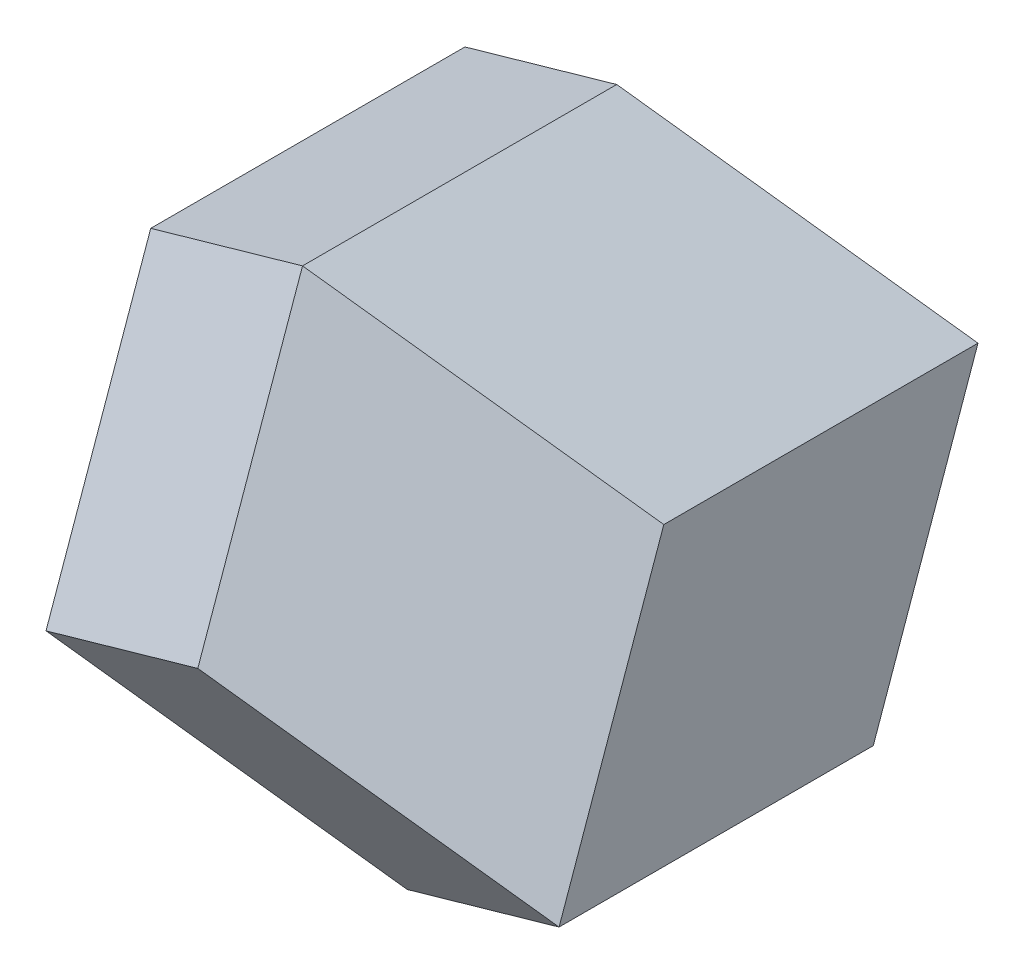
ISO-10303-21;
HEADER;
FILE_DESCRIPTION(('STEP AP214'),'2;1');
FILE_NAME('part.step','',(''),(''),'','','');
FILE_SCHEMA(('AUTOMOTIVE_DESIGN { 1 0 10303 214 1 1 1 1 }'));
ENDSEC;
DATA;
#1=APPLICATION_CONTEXT('core data for automotive mechanical design processes');
#2=APPLICATION_PROTOCOL_DEFINITION('international standard','automotive_design',2000,#1);
#3=PRODUCT_CONTEXT('',#1,'mechanical');
#4=PRODUCT('Part','Part','',(#3));
#5=PRODUCT_RELATED_PRODUCT_CATEGORY('part','',(#4));
#6=PRODUCT_DEFINITION_FORMATION('','',#4);
#7=PRODUCT_DEFINITION_CONTEXT('part definition',#1,'design');
#8=PRODUCT_DEFINITION('design','',#6,#7);
#9=PRODUCT_DEFINITION_SHAPE('','',#8);
#10=(LENGTH_UNIT() NAMED_UNIT(*) SI_UNIT(.MILLI.,.METRE.));
#11=(NAMED_UNIT(*) PLANE_ANGLE_UNIT() SI_UNIT($,.RADIAN.));
#12=(NAMED_UNIT(*) SI_UNIT($,.STERADIAN.) SOLID_ANGLE_UNIT());
#13=UNCERTAINTY_MEASURE_WITH_UNIT(LENGTH_MEASURE(1.E-05),#10,'distance_accuracy_value','');
#14=(GEOMETRIC_REPRESENTATION_CONTEXT(3) GLOBAL_UNCERTAINTY_ASSIGNED_CONTEXT((#13)) GLOBAL_UNIT_ASSIGNED_CONTEXT((#10,
#11,#12)) REPRESENTATION_CONTEXT('',''));
#15=CARTESIAN_POINT('',(0.,0.,0.));
#16=DIRECTION('',(0.,0.,1.));
#17=DIRECTION('',(1.,0.,0.));
#18=AXIS2_PLACEMENT_3D('',#15,#16,#17);
#19=CARTESIAN_POINT('',(-0.816496580928,-0.471404640838,-0.333333418219));
#20=DIRECTION('',(-0.50000000000022,-0.288674987568127,-0.81649663290936));
#21=DIRECTION('',(-0.852802880229533,0.,0.522232943687215));
#22=AXIS2_PLACEMENT_3D('',#19,#20,#21);
#23=PLANE('',#22);
#24=DIRECTION('',(-0.816496580927737,0.471404460767848,0.333333418218893));
#25=VECTOR('',#24,1.);
#26=CARTESIAN_POINT('',(0.,0.,-1.));
#27=LINE('',#26,#25);
#28=CARTESIAN_POINT('',(0.,0.,-1.));
#29=VERTEX_POINT('',#28);
#30=CARTESIAN_POINT('',(-0.816496580928,0.471404460768,-0.666666581781));
#31=VERTEX_POINT('',#30);
#32=EDGE_CURVE('E161',#29,#31,#27,.T.);
#33=ORIENTED_EDGE('',*,*,#32,.F.);
#34=DIRECTION('',(0.,-0.942809101605246,0.333333163562087));
#35=VECTOR('',#34,1.);
#36=CARTESIAN_POINT('',(0.,0.,-1.));
#37=LINE('',#36,#35);
#38=CARTESIAN_POINT('',(0.,-0.942809101605,-0.666666836438));
#39=VERTEX_POINT('',#38);
#40=EDGE_CURVE('E9',#29,#39,#37,.T.);
#41=ORIENTED_EDGE('',*,*,#40,.T.);
#42=DIRECTION('',(0.816496580927737,-0.471404460767848,-0.333333418218893));
#43=VECTOR('',#42,1.);
#44=CARTESIAN_POINT('',(-0.816496580928,-0.471404640838,-0.333333418219));
#45=LINE('',#44,#43);
#46=CARTESIAN_POINT('',(-0.816496580928,-0.471404640838,-0.333333418219));
#47=VERTEX_POINT('',#46);
#48=EDGE_CURVE('E25',#47,#39,#45,.T.);
#49=ORIENTED_EDGE('',*,*,#48,.F.);
#50=DIRECTION('',(0.,0.942809101605246,-0.333333163562087));
#51=VECTOR('',#50,1.);
#52=CARTESIAN_POINT('',(-0.816496580928,-0.471404640838,-0.333333418219));
#53=LINE('',#52,#51);
#54=EDGE_CURVE('E174',#47,#31,#53,.T.);
#55=ORIENTED_EDGE('',*,*,#54,.T.);
#56=EDGE_LOOP('',(#33,#41,#49,#55));
#57=FACE_BOUND('',#56,.T.);
#58=ADVANCED_FACE('F14',(#57),#23,.T.);
#59=CARTESIAN_POINT('',(0.,0.,-1.));
#60=DIRECTION('',(0.50000000000022,-0.288674987568127,-0.81649663290936));
#61=DIRECTION('',(0.,-0.942809101605422,0.333333163561589));
#62=AXIS2_PLACEMENT_3D('',#59,#60,#61);
#63=PLANE('',#62);
#64=DIRECTION('',(0.,0.942809101605246,-0.333333163562087));
#65=VECTOR('',#64,1.);
#66=CARTESIAN_POINT('',(0.816496580928,-0.471404640838,-0.333333418219));
#67=LINE('',#66,#65);
#68=CARTESIAN_POINT('',(0.816496580928,-0.471404640838,-0.333333418219));
#69=VERTEX_POINT('',#68);
#70=CARTESIAN_POINT('',(0.816496580928,0.471404460768,-0.666666581781));
#71=VERTEX_POINT('',#70);
#72=EDGE_CURVE('E150',#69,#71,#67,.T.);
#73=ORIENTED_EDGE('',*,*,#72,.F.);
#74=DIRECTION('',(-0.816496580927737,-0.471404460767848,-0.333333418218893));
#75=VECTOR('',#74,1.);
#76=CARTESIAN_POINT('',(0.816496580928,-0.471404640838,-0.333333418219));
#77=LINE('',#76,#75);
#78=EDGE_CURVE('E88',#69,#39,#77,.T.);
#79=ORIENTED_EDGE('',*,*,#78,.T.);
#80=ORIENTED_EDGE('',*,*,#40,.F.);
#81=DIRECTION('',(0.816496580927737,0.471404460767848,0.333333418218893));
#82=VECTOR('',#81,1.);
#83=CARTESIAN_POINT('',(0.,0.,-1.));
#84=LINE('',#83,#82);
#85=EDGE_CURVE('E164',#29,#71,#84,.T.);
#86=ORIENTED_EDGE('',*,*,#85,.T.);
#87=EDGE_LOOP('',(#73,#79,#80,#86));
#88=FACE_BOUND('',#87,.T.);
#89=ADVANCED_FACE('F206',(#88),#63,.T.);
#90=CARTESIAN_POINT('',(0.,-0.942809281675,0.333333163562));
#91=DIRECTION('',(-0.500000000000184,-0.866025403784318,-1.55945109048358E-07));
#92=DIRECTION('',(-0.866025403784329,0.50000000000019,0.));
#93=AXIS2_PLACEMENT_3D('',#90,#91,#92);
#94=PLANE('',#93);
#95=DIRECTION('',(0.,-1.80069901267697E-07,0.999999999999984));
#96=VECTOR('',#95,1.);
#97=CARTESIAN_POINT('',(-0.816496580928,-0.471404640838,-0.333333418219));
#98=LINE('',#97,#96);
#99=CARTESIAN_POINT('',(-0.816496580928,-0.471404820908,0.666666581781));
#100=VERTEX_POINT('',#99);
#101=EDGE_CURVE('E139',#47,#100,#98,.T.);
#102=ORIENTED_EDGE('',*,*,#101,.F.);
#103=ORIENTED_EDGE('',*,*,#48,.T.);
#104=DIRECTION('',(0.,1.80069900934697E-07,-0.999999999999984));
#105=VECTOR('',#104,1.);
#106=CARTESIAN_POINT('',(0.,-0.942809281675,0.333333163562));
#107=LINE('',#106,#105);
#108=CARTESIAN_POINT('',(0.,-0.942809281675,0.333333163562));
#109=VERTEX_POINT('',#108);
#110=EDGE_CURVE('E79',#109,#39,#107,.T.);
#111=ORIENTED_EDGE('',*,*,#110,.F.);
#112=DIRECTION('',(-0.816496580927737,0.471404460767848,0.333333418218893));
#113=VECTOR('',#112,1.);
#114=CARTESIAN_POINT('',(0.,-0.942809281675,0.333333163562));
#115=LINE('',#114,#113);
#116=EDGE_CURVE('E84',#109,#100,#115,.T.);
#117=ORIENTED_EDGE('',*,*,#116,.T.);
#118=EDGE_LOOP('',(#102,#103,#111,#117));
#119=FACE_BOUND('',#118,.T.);
#120=ADVANCED_FACE('F82',(#119),#94,.T.);
#121=CARTESIAN_POINT('',(0.,0.942808921535,-0.333333163562));
#122=DIRECTION('',(0.,0.57735041621617,-0.81649647696424));
#123=DIRECTION('',(-1.,0.,0.));
#124=AXIS2_PLACEMENT_3D('',#121,#122,#123);
#125=PLANE('',#124);
#126=DIRECTION('',(-0.816496580927737,-0.471404460767848,-0.333333418218893));
#127=VECTOR('',#126,1.);
#128=CARTESIAN_POINT('',(0.,0.942808921535,-0.333333163562));
#129=LINE('',#128,#127);
#130=CARTESIAN_POINT('',(0.,0.942808921535,-0.333333163562));
#131=VERTEX_POINT('',#130);
#132=EDGE_CURVE('E147',#131,#31,#129,.T.);
#133=ORIENTED_EDGE('',*,*,#132,.F.);
#134=DIRECTION('',(0.816496580927737,-0.471404460767848,-0.333333418218893));
#135=VECTOR('',#134,1.);
#136=CARTESIAN_POINT('',(0.,0.942808921535,-0.333333163562));
#137=LINE('',#136,#135);
#138=EDGE_CURVE('E140',#131,#71,#137,.T.);
#139=ORIENTED_EDGE('',*,*,#138,.T.);
#140=ORIENTED_EDGE('',*,*,#85,.F.);
#141=ORIENTED_EDGE('',*,*,#32,.T.);
#142=EDGE_LOOP('',(#133,#139,#140,#141));
#143=FACE_BOUND('',#142,.T.);
#144=ADVANCED_FACE('F196',(#143),#125,.T.);
#145=CARTESIAN_POINT('',(-0.816496580928,0.471404280698,0.333333418219));
#146=DIRECTION('',(0.500000000000184,-0.866025403784319,-1.55945108715257E-07));
#147=DIRECTION('',(0.,1.8006990099114E-07,-0.999999999999984));
#148=AXIS2_PLACEMENT_3D('',#145,#146,#147);
#149=PLANE('',#148);
#150=DIRECTION('',(0.,1.80069901128997E-07,-0.999999999999984));
#151=VECTOR('',#150,1.);
#152=CARTESIAN_POINT('',(-0.816496580928,0.471404280698,0.333333418219));
#153=LINE('',#152,#151);
#154=CARTESIAN_POINT('',(-0.816496580928,0.471404280698,0.333333418219));
#155=VERTEX_POINT('',#154);
#156=EDGE_CURVE('E143',#155,#31,#153,.T.);
#157=ORIENTED_EDGE('',*,*,#156,.F.);
#158=DIRECTION('',(0.816496580927737,0.471404460767848,0.333333418218893));
#159=VECTOR('',#158,1.);
#160=CARTESIAN_POINT('',(-0.816496580928,0.471404280698,0.333333418219));
#161=LINE('',#160,#159);
#162=CARTESIAN_POINT('',(0.,0.942808741466,0.666666836438));
#163=VERTEX_POINT('',#162);
#164=EDGE_CURVE('E114',#155,#163,#161,.T.);
#165=ORIENTED_EDGE('',*,*,#164,.T.);
#166=DIRECTION('',(0.,-1.80069900934697E-07,0.999999999999984));
#167=VECTOR('',#166,1.);
#168=CARTESIAN_POINT('',(0.,0.942808921535,-0.333333163562));
#169=LINE('',#168,#167);
#170=EDGE_CURVE('E89',#131,#163,#169,.T.);
#171=ORIENTED_EDGE('',*,*,#170,.F.);
#172=ORIENTED_EDGE('',*,*,#132,.T.);
#173=EDGE_LOOP('',(#157,#165,#171,#172));
#174=FACE_BOUND('',#173,.T.);
#175=ADVANCED_FACE('F192',(#174),#149,.F.);
#176=CARTESIAN_POINT('',(-0.816496580928,0.471404280698,0.333333418219));
#177=DIRECTION('',(1.,0.,0.));
#178=DIRECTION('',(0.,0.,1.));
#179=AXIS2_PLACEMENT_3D('',#176,#177,#178);
#180=PLANE('',#179);
#181=ORIENTED_EDGE('',*,*,#54,.F.);
#182=ORIENTED_EDGE('',*,*,#101,.T.);
#183=DIRECTION('',(0.,-0.942809101605246,0.333333163562087));
#184=VECTOR('',#183,1.);
#185=CARTESIAN_POINT('',(-0.816496580928,0.471404280698,0.333333418219));
#186=LINE('',#185,#184);
#187=EDGE_CURVE('E117',#155,#100,#186,.T.);
#188=ORIENTED_EDGE('',*,*,#187,.F.);
#189=ORIENTED_EDGE('',*,*,#156,.T.);
#190=EDGE_LOOP('',(#181,#182,#188,#189));
#191=FACE_BOUND('',#190,.T.);
#192=ADVANCED_FACE('F183',(#191),#180,.F.);
#193=CARTESIAN_POINT('',(0.816496580928,-0.471404640838,-0.333333418219));
#194=DIRECTION('',(0.500000000000184,-0.866025403784319,-1.55945108715257E-07));
#195=DIRECTION('',(0.,1.8006990099114E-07,-0.999999999999984));
#196=AXIS2_PLACEMENT_3D('',#193,#194,#195);
#197=PLANE('',#196);
#198=DIRECTION('',(0.816496580927737,0.471404460767848,0.333333418218893));
#199=VECTOR('',#198,1.);
#200=CARTESIAN_POINT('',(0.,-0.942809281675,0.333333163562));
#201=LINE('',#200,#199);
#202=CARTESIAN_POINT('',(0.816496580928,-0.471404820908,0.666666581781));
#203=VERTEX_POINT('',#202);
#204=EDGE_CURVE('E93',#109,#203,#201,.T.);
#205=ORIENTED_EDGE('',*,*,#204,.F.);
#206=ORIENTED_EDGE('',*,*,#110,.T.);
#207=ORIENTED_EDGE('',*,*,#78,.F.);
#208=DIRECTION('',(0.,-1.80069901128997E-07,0.999999999999984));
#209=VECTOR('',#208,1.);
#210=CARTESIAN_POINT('',(0.816496580928,-0.471404640838,-0.333333418219));
#211=LINE('',#210,#209);
#212=EDGE_CURVE('E96',#69,#203,#211,.T.);
#213=ORIENTED_EDGE('',*,*,#212,.T.);
#214=EDGE_LOOP('',(#205,#206,#207,#213));
#215=FACE_BOUND('',#214,.T.);
#216=ADVANCED_FACE('F94',(#215),#197,.T.);
#217=CARTESIAN_POINT('',(0.,0.942808921535,-0.333333163562));
#218=DIRECTION('',(-0.500000000000184,-0.866025403784318,-1.55945109048358E-07));
#219=DIRECTION('',(-0.866025403784329,0.50000000000019,0.));
#220=AXIS2_PLACEMENT_3D('',#217,#218,#219);
#221=PLANE('',#220);
#222=ORIENTED_EDGE('',*,*,#138,.F.);
#223=ORIENTED_EDGE('',*,*,#170,.T.);
#224=DIRECTION('',(-0.816496580927737,0.471404460767848,0.333333418218893));
#225=VECTOR('',#224,1.);
#226=CARTESIAN_POINT('',(0.816496580928,0.471404280698,0.333333418219));
#227=LINE('',#226,#225);
#228=CARTESIAN_POINT('',(0.816496580928,0.471404280698,0.333333418219));
#229=VERTEX_POINT('',#228);
#230=EDGE_CURVE('E122',#229,#163,#227,.T.);
#231=ORIENTED_EDGE('',*,*,#230,.F.);
#232=DIRECTION('',(0.,1.80069901267697E-07,-0.999999999999984));
#233=VECTOR('',#232,1.);
#234=CARTESIAN_POINT('',(0.816496580928,0.471404280698,0.333333418219));
#235=LINE('',#234,#233);
#236=EDGE_CURVE('E118',#229,#71,#235,.T.);
#237=ORIENTED_EDGE('',*,*,#236,.T.);
#238=EDGE_LOOP('',(#222,#223,#231,#237));
#239=FACE_BOUND('',#238,.T.);
#240=ADVANCED_FACE('F216',(#239),#221,.F.);
#241=CARTESIAN_POINT('',(0.,-3.601398021469E-07,1.));
#242=DIRECTION('',(0.50000000000022,-0.288674987568127,-0.81649663290936));
#243=DIRECTION('',(0.,-0.942809101605422,0.333333163561589));
#244=AXIS2_PLACEMENT_3D('',#241,#242,#243);
#245=PLANE('',#244);
#246=DIRECTION('',(-0.816496580927737,-0.471404460767848,-0.333333418218893));
#247=VECTOR('',#246,1.);
#248=CARTESIAN_POINT('',(0.,-3.601398021469E-07,1.));
#249=LINE('',#248,#247);
#250=CARTESIAN_POINT('',(0.,-3.601398021759E-07,1.));
#251=VERTEX_POINT('',#250);
#252=EDGE_CURVE('E103',#251,#100,#249,.T.);
#253=ORIENTED_EDGE('',*,*,#252,.F.);
#254=DIRECTION('',(0.,0.942809101605246,-0.333333163562087));
#255=VECTOR('',#254,1.);
#256=CARTESIAN_POINT('',(0.,-3.601398022024E-07,1.));
#257=LINE('',#256,#255);
#258=EDGE_CURVE('E18',#251,#163,#257,.T.);
#259=ORIENTED_EDGE('',*,*,#258,.T.);
#260=ORIENTED_EDGE('',*,*,#164,.F.);
#261=ORIENTED_EDGE('',*,*,#187,.T.);
#262=EDGE_LOOP('',(#253,#259,#260,#261));
#263=FACE_BOUND('',#262,.T.);
#264=ADVANCED_FACE('F186',(#263),#245,.F.);
#265=CARTESIAN_POINT('',(0.816496580928,0.471404280698,0.333333418219));
#266=DIRECTION('',(-1.,0.,0.));
#267=DIRECTION('',(0.,0.,1.));
#268=AXIS2_PLACEMENT_3D('',#265,#266,#267);
#269=PLANE('',#268);
#270=ORIENTED_EDGE('',*,*,#212,.F.);
#271=ORIENTED_EDGE('',*,*,#72,.T.);
#272=ORIENTED_EDGE('',*,*,#236,.F.);
#273=DIRECTION('',(0.,-0.942809101605246,0.333333163562087));
#274=VECTOR('',#273,1.);
#275=CARTESIAN_POINT('',(0.816496580928,0.471404280698,0.333333418219));
#276=LINE('',#275,#274);
#277=EDGE_CURVE('E119',#229,#203,#276,.T.);
#278=ORIENTED_EDGE('',*,*,#277,.T.);
#279=EDGE_LOOP('',(#270,#271,#272,#278));
#280=FACE_BOUND('',#279,.T.);
#281=ADVANCED_FACE('F207',(#280),#269,.F.);
#282=CARTESIAN_POINT('',(0.,-3.601398022579E-07,1.));
#283=DIRECTION('',(0.,-0.57735041621617,0.81649647696424));
#284=DIRECTION('',(-1.,0.,0.));
#285=AXIS2_PLACEMENT_3D('',#282,#283,#284);
#286=PLANE('',#285);
#287=DIRECTION('',(0.816496580927737,-0.471404460767848,-0.333333418218893));
#288=VECTOR('',#287,1.);
#289=CARTESIAN_POINT('',(0.,-3.601398022579E-07,1.));
#290=LINE('',#289,#288);
#291=EDGE_CURVE('E109',#251,#203,#290,.T.);
#292=ORIENTED_EDGE('',*,*,#291,.F.);
#293=ORIENTED_EDGE('',*,*,#252,.T.);
#294=ORIENTED_EDGE('',*,*,#116,.F.);
#295=ORIENTED_EDGE('',*,*,#204,.T.);
#296=EDGE_LOOP('',(#292,#293,#294,#295));
#297=FACE_BOUND('',#296,.T.);
#298=ADVANCED_FACE('F102',(#297),#286,.T.);
#299=CARTESIAN_POINT('',(0.816496580928,0.471404280698,0.333333418219));
#300=DIRECTION('',(-0.50000000000022,-0.288674987568127,-0.81649663290936));
#301=DIRECTION('',(-0.852802880229533,0.,0.522232943687215));
#302=AXIS2_PLACEMENT_3D('',#299,#300,#301);
#303=PLANE('',#302);
#304=ORIENTED_EDGE('',*,*,#277,.F.);
#305=ORIENTED_EDGE('',*,*,#230,.T.);
#306=ORIENTED_EDGE('',*,*,#258,.F.);
#307=ORIENTED_EDGE('',*,*,#291,.T.);
#308=EDGE_LOOP('',(#304,#305,#306,#307));
#309=FACE_BOUND('',#308,.T.);
#310=ADVANCED_FACE('F16',(#309),#303,.F.);
#311=CLOSED_SHELL('',(#58,#89,#120,#144,#175,#192,#216,#240,#264,#281,#298,#310));
#312=MANIFOLD_SOLID_BREP('B1',#311);
#313=ADVANCED_BREP_SHAPE_REPRESENTATION('',(#18,#312),#14);
#314=SHAPE_DEFINITION_REPRESENTATION(#9,#313);
ENDSEC;
END-ISO-10303-21;
